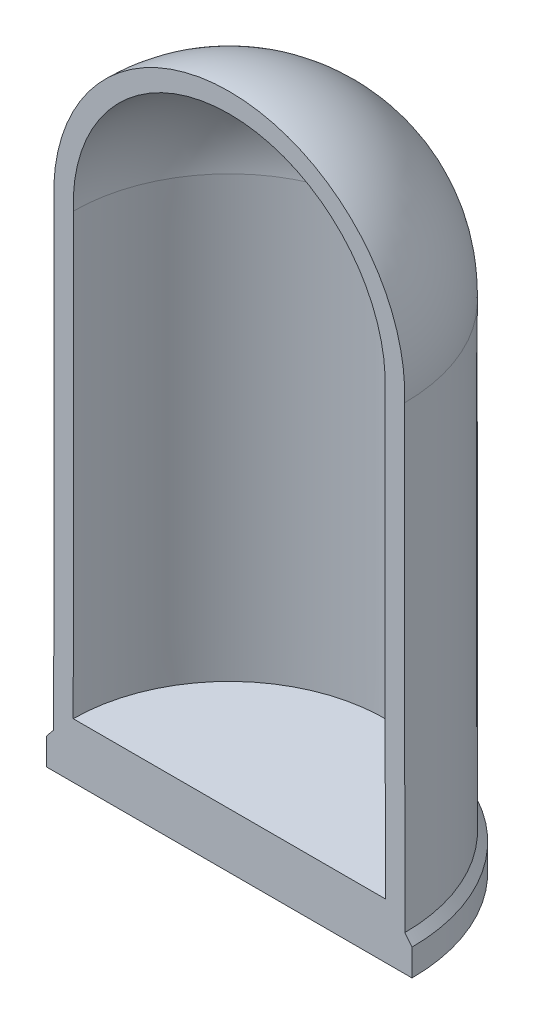
ISO-10303-21;
HEADER;
FILE_DESCRIPTION(('STEP AP214'),'2;1');
FILE_NAME('part.step','',(''),(''),'','','');
FILE_SCHEMA(('AUTOMOTIVE_DESIGN { 1 0 10303 214 1 1 1 1 }'));
ENDSEC;
DATA;
#1=APPLICATION_CONTEXT('core data for automotive mechanical design processes');
#2=APPLICATION_PROTOCOL_DEFINITION('international standard','automotive_design',2000,#1);
#3=PRODUCT_CONTEXT('',#1,'mechanical');
#4=PRODUCT('Part','Part','',(#3));
#5=PRODUCT_RELATED_PRODUCT_CATEGORY('part','',(#4));
#6=PRODUCT_DEFINITION_FORMATION('','',#4);
#7=PRODUCT_DEFINITION_CONTEXT('part definition',#1,'design');
#8=PRODUCT_DEFINITION('design','',#6,#7);
#9=PRODUCT_DEFINITION_SHAPE('','',#8);
#10=(LENGTH_UNIT() NAMED_UNIT(*) SI_UNIT(.MILLI.,.METRE.));
#11=(NAMED_UNIT(*) PLANE_ANGLE_UNIT() SI_UNIT($,.RADIAN.));
#12=(NAMED_UNIT(*) SI_UNIT($,.STERADIAN.) SOLID_ANGLE_UNIT());
#13=UNCERTAINTY_MEASURE_WITH_UNIT(LENGTH_MEASURE(1.E-05),#10,'distance_accuracy_value','');
#14=(GEOMETRIC_REPRESENTATION_CONTEXT(3) GLOBAL_UNCERTAINTY_ASSIGNED_CONTEXT((#13)) GLOBAL_UNIT_ASSIGNED_CONTEXT((#10,
#11,#12)) REPRESENTATION_CONTEXT('',''));
#15=CARTESIAN_POINT('',(0.,0.,0.));
#16=DIRECTION('',(0.,0.,1.));
#17=DIRECTION('',(1.,0.,0.));
#18=AXIS2_PLACEMENT_3D('',#15,#16,#17);
#19=CARTESIAN_POINT('',(0.,-61.875,0.));
#20=DIRECTION('',(0.,1.,0.));
#21=DIRECTION('',(-1.,0.,0.));
#22=AXIS2_PLACEMENT_3D('',#19,#20,#21);
#23=PLANE('',#22);
#24=CARTESIAN_POINT('',(0.,-61.875,0.));
#25=DIRECTION('',(0.,-1.,0.));
#26=DIRECTION('',(1.,0.,0.));
#27=AXIS2_PLACEMENT_3D('',#24,#25,#26);
#28=CIRCLE('',#27,205.);
#29=CARTESIAN_POINT('',(-205.,-61.875,1.43150734892569E-12));
#30=VERTEX_POINT('',#29);
#31=CARTESIAN_POINT('',(205.,-61.875,0.));
#32=VERTEX_POINT('',#31);
#33=EDGE_CURVE('E11',#30,#32,#28,.T.);
#34=ORIENTED_EDGE('',*,*,#33,.T.);
#35=DIRECTION('',(1.,0.,0.));
#36=VECTOR('',#35,1.);
#37=CARTESIAN_POINT('',(0.,-61.875,0.));
#38=LINE('',#37,#36);
#39=EDGE_CURVE('E88',#30,#32,#38,.T.);
#40=ORIENTED_EDGE('',*,*,#39,.F.);
#41=EDGE_LOOP('',(#34,#40));
#42=FACE_BOUND('',#41,.T.);
#43=ADVANCED_FACE('F34',(#42),#23,.F.);
#44=CARTESIAN_POINT('',(0.,914.773331767094,0.));
#45=DIRECTION('',(0.,-1.,0.));
#46=DIRECTION('',(1.,0.,0.));
#47=AXIS2_PLACEMENT_3D('',#44,#45,#46);
#48=CYLINDRICAL_SURFACE('',#47,205.);
#49=CARTESIAN_POINT('',(0.,-31.875,0.));
#50=DIRECTION('',(0.,-1.,0.));
#51=DIRECTION('',(1.,0.,0.));
#52=AXIS2_PLACEMENT_3D('',#49,#50,#51);
#53=CIRCLE('',#52,205.);
#54=CARTESIAN_POINT('',(-205.,-31.875,1.43150734892569E-12));
#55=VERTEX_POINT('',#54);
#56=CARTESIAN_POINT('',(205.,-31.875,0.));
#57=VERTEX_POINT('',#56);
#58=EDGE_CURVE('E41',#55,#57,#53,.T.);
#59=ORIENTED_EDGE('',*,*,#58,.T.);
#60=DIRECTION('',(0.,-1.,0.));
#61=VECTOR('',#60,1.);
#62=CARTESIAN_POINT('',(205.,0.,0.));
#63=LINE('',#62,#61);
#64=EDGE_CURVE('E92',#57,#32,#63,.T.);
#65=ORIENTED_EDGE('',*,*,#64,.T.);
#66=ORIENTED_EDGE('',*,*,#33,.F.);
#67=DIRECTION('',(0.,-1.,0.));
#68=VECTOR('',#67,1.);
#69=CARTESIAN_POINT('',(-205.,0.,1.43150734892569E-12));
#70=LINE('',#69,#68);
#71=EDGE_CURVE('E96',#55,#30,#70,.T.);
#72=ORIENTED_EDGE('',*,*,#71,.F.);
#73=EDGE_LOOP('',(#59,#65,#66,#72));
#74=FACE_BOUND('',#73,.T.);
#75=ADVANCED_FACE('F101',(#74),#48,.T.);
#76=CARTESIAN_POINT('',(0.,-21.875,0.));
#77=DIRECTION('',(0.,-1.,0.));
#78=DIRECTION('',(1.,0.,0.));
#79=AXIS2_PLACEMENT_3D('',#76,#77,#78);
#80=CONICAL_SURFACE('',#79,196.880944780873,0.68195836505234);
#81=CARTESIAN_POINT('',(0.,-21.875,0.));
#82=DIRECTION('',(0.,-1.,0.));
#83=DIRECTION('',(1.,0.,0.));
#84=AXIS2_PLACEMENT_3D('',#81,#82,#83);
#85=CIRCLE('',#84,196.880944780873);
#86=CARTESIAN_POINT('',(-196.880944780873,-21.875,1.37481228935245E-12));
#87=VERTEX_POINT('',#86);
#88=CARTESIAN_POINT('',(196.880944780873,-21.875,0.));
#89=VERTEX_POINT('',#88);
#90=EDGE_CURVE('E131',#87,#89,#85,.T.);
#91=ORIENTED_EDGE('',*,*,#90,.T.);
#92=DIRECTION('',(0.630314588512039,-0.776339822184138,0.));
#93=VECTOR('',#92,1.);
#94=CARTESIAN_POINT('',(107.956562690674,87.6505293752746,0.));
#95=LINE('',#94,#93);
#96=EDGE_CURVE('E102',#89,#57,#95,.T.);
#97=ORIENTED_EDGE('',*,*,#96,.T.);
#98=ORIENTED_EDGE('',*,*,#58,.F.);
#99=DIRECTION('',(-0.630314588512039,-0.776339822184138,0.));
#100=VECTOR('',#99,1.);
#101=CARTESIAN_POINT('',(-107.956562690674,87.6505293752746,7.53856648080273E-13));
#102=LINE('',#101,#100);
#103=EDGE_CURVE('E111',#87,#55,#102,.T.);
#104=ORIENTED_EDGE('',*,*,#103,.F.);
#105=EDGE_LOOP('',(#91,#97,#98,#104));
#106=FACE_BOUND('',#105,.T.);
#107=ADVANCED_FACE('F134',(#106),#80,.T.);
#108=CARTESIAN_POINT('',(0.,-21.875,0.));
#109=DIRECTION('',(0.,-1.,0.));
#110=DIRECTION('',(1.,0.,0.));
#111=AXIS2_PLACEMENT_3D('',#108,#109,#110);
#112=CONICAL_SURFACE('',#111,196.880944780873,0.000271724487689886);
#113=CARTESIAN_POINT('',(0.,492.740467835131,0.));
#114=DIRECTION('',(0.,-1.,0.));
#115=DIRECTION('',(1.,0.,0.));
#116=AXIS2_PLACEMENT_3D('',#113,#114,#115);
#117=CIRCLE('',#116,196.741111153077);
#118=CARTESIAN_POINT('',(-196.741111153077,492.740467835131,1.37383583634846E-12));
#119=VERTEX_POINT('',#118);
#120=CARTESIAN_POINT('',(196.741111153077,492.740467835131,0.));
#121=VERTEX_POINT('',#120);
#122=EDGE_CURVE('E128',#119,#121,#117,.T.);
#123=ORIENTED_EDGE('',*,*,#122,.T.);
#124=DIRECTION('',(-0.000271724484346169,0.999999963082902,0.));
#125=VECTOR('',#124,1.);
#126=CARTESIAN_POINT('',(196.874986271451,0.0534957561001773,0.));
#127=LINE('',#126,#125);
#128=EDGE_CURVE('E104',#89,#121,#127,.T.);
#129=ORIENTED_EDGE('',*,*,#128,.F.);
#130=ORIENTED_EDGE('',*,*,#90,.F.);
#131=DIRECTION('',(0.000271724484346253,0.999999963082902,0.));
#132=VECTOR('',#131,1.);
#133=CARTESIAN_POINT('',(-196.874986271451,0.0534957561001937,1.37477068130354E-12));
#134=LINE('',#133,#132);
#135=EDGE_CURVE('E113',#87,#119,#134,.T.);
#136=ORIENTED_EDGE('',*,*,#135,.T.);
#137=EDGE_LOOP('',(#123,#129,#130,#136));
#138=FACE_BOUND('',#137,.T.);
#139=ADVANCED_FACE('F139',(#138),#112,.T.);
#140=CARTESIAN_POINT('',(0.,500.,0.));
#141=DIRECTION('',(0.,-1.,0.));
#142=DIRECTION('',(-1.,0.,0.));
#143=AXIS2_PLACEMENT_3D('',#140,#141,#142);
#144=SPHERICAL_SURFACE('',#143,196.875);
#145=CARTESIAN_POINT('',(0.,500.,0.));
#146=DIRECTION('',(0.,0.,-1.));
#147=DIRECTION('',(-1.,0.,0.));
#148=AXIS2_PLACEMENT_3D('',#145,#146,#147);
#149=CIRCLE('',#148,196.875);
#150=EDGE_CURVE('E116',#119,#121,#149,.T.);
#151=ORIENTED_EDGE('',*,*,#150,.T.);
#152=ORIENTED_EDGE('',*,*,#122,.F.);
#153=EDGE_LOOP('',(#151,#152));
#154=FACE_BOUND('',#153,.T.);
#155=ADVANCED_FACE('F141',(#154),#144,.T.);
#156=CARTESIAN_POINT('',(0.,500.,0.));
#157=DIRECTION('',(0.,-1.,0.));
#158=DIRECTION('',(-1.,0.,0.));
#159=AXIS2_PLACEMENT_3D('',#156,#157,#158);
#160=SPHERICAL_SURFACE('',#159,175.);
#161=CARTESIAN_POINT('',(0.,493.152909574824,0.));
#162=DIRECTION('',(0.,-1.,0.));
#163=DIRECTION('',(1.,0.,0.));
#164=AXIS2_PLACEMENT_3D('',#161,#162,#163);
#165=CIRCLE('',#164,174.865998274992);
#166=CARTESIAN_POINT('',(-174.865998274992,493.152909574824,1.22108273955062E-12));
#167=VERTEX_POINT('',#166);
#168=CARTESIAN_POINT('',(174.865998274992,493.152909574824,0.));
#169=VERTEX_POINT('',#168);
#170=EDGE_CURVE('E54',#167,#169,#165,.T.);
#171=ORIENTED_EDGE('',*,*,#170,.T.);
#172=CARTESIAN_POINT('',(0.,500.,0.));
#173=DIRECTION('',(0.,0.,-1.));
#174=DIRECTION('',(-1.,0.,0.));
#175=AXIS2_PLACEMENT_3D('',#172,#173,#174);
#176=CIRCLE('',#175,175.);
#177=EDGE_CURVE('E118',#167,#169,#176,.T.);
#178=ORIENTED_EDGE('',*,*,#177,.F.);
#179=EDGE_LOOP('',(#171,#178));
#180=FACE_BOUND('',#179,.T.);
#181=ADVANCED_FACE('F143',(#180),#160,.F.);
#182=CARTESIAN_POINT('',(0.,0.,0.));
#183=DIRECTION('',(0.,-1.,0.));
#184=DIRECTION('',(1.,0.,0.));
#185=AXIS2_PLACEMENT_3D('',#182,#183,#184);
#186=CONICAL_SURFACE('',#185,174.999999999997,0.000271724487689777);
#187=CARTESIAN_POINT('',(0.,0.,0.));
#188=DIRECTION('',(0.,-1.,0.));
#189=DIRECTION('',(1.,0.,0.));
#190=AXIS2_PLACEMENT_3D('',#187,#188,#189);
#191=CIRCLE('',#190,174.999999999997);
#192=CARTESIAN_POINT('',(-174.999999999997,0.,1.22201846859507E-12));
#193=VERTEX_POINT('',#192);
#194=CARTESIAN_POINT('',(174.999999999997,0.,0.));
#195=VERTEX_POINT('',#194);
#196=EDGE_CURVE('E47',#193,#195,#191,.T.);
#197=ORIENTED_EDGE('',*,*,#196,.T.);
#198=DIRECTION('',(-0.000271724484346128,0.999999963082902,0.));
#199=VECTOR('',#198,1.);
#200=CARTESIAN_POINT('',(174.999987079013,0.0475517830050977,0.));
#201=LINE('',#200,#199);
#202=EDGE_CURVE('E98',#195,#169,#201,.T.);
#203=ORIENTED_EDGE('',*,*,#202,.T.);
#204=ORIENTED_EDGE('',*,*,#170,.F.);
#205=DIRECTION('',(0.000271724484346212,0.999999963082902,0.));
#206=VECTOR('',#205,1.);
#207=CARTESIAN_POINT('',(-174.999987079013,0.0475517830051122,1.22201837836832E-12));
#208=LINE('',#207,#206);
#209=EDGE_CURVE('E120',#193,#167,#208,.T.);
#210=ORIENTED_EDGE('',*,*,#209,.F.);
#211=EDGE_LOOP('',(#197,#203,#204,#210));
#212=FACE_BOUND('',#211,.T.);
#213=ADVANCED_FACE('F149',(#212),#186,.F.);
#214=CARTESIAN_POINT('',(0.,0.,0.));
#215=DIRECTION('',(0.,-1.,0.));
#216=DIRECTION('',(1.,0.,0.));
#217=AXIS2_PLACEMENT_3D('',#214,#215,#216);
#218=PLANE('',#217);
#219=DIRECTION('',(-1.,0.,0.));
#220=VECTOR('',#219,1.);
#221=CARTESIAN_POINT('',(0.,0.,0.));
#222=LINE('',#221,#220);
#223=EDGE_CURVE('E123',#195,#193,#222,.T.);
#224=ORIENTED_EDGE('',*,*,#223,.F.);
#225=ORIENTED_EDGE('',*,*,#196,.F.);
#226=EDGE_LOOP('',(#224,#225));
#227=FACE_BOUND('',#226,.T.);
#228=ADVANCED_FACE('F186',(#227),#218,.F.);
#229=CARTESIAN_POINT('',(0.,0.,0.));
#230=DIRECTION('',(0.,0.,-1.));
#231=DIRECTION('',(-1.,0.,0.));
#232=AXIS2_PLACEMENT_3D('',#229,#230,#231);
#233=PLANE('',#232);
#234=ORIENTED_EDGE('',*,*,#202,.F.);
#235=ORIENTED_EDGE('',*,*,#223,.T.);
#236=ORIENTED_EDGE('',*,*,#209,.T.);
#237=ORIENTED_EDGE('',*,*,#177,.T.);
#238=EDGE_LOOP('',(#234,#235,#236,#237));
#239=FACE_BOUND('',#238,.T.);
#240=ORIENTED_EDGE('',*,*,#39,.T.);
#241=ORIENTED_EDGE('',*,*,#64,.F.);
#242=ORIENTED_EDGE('',*,*,#96,.F.);
#243=ORIENTED_EDGE('',*,*,#128,.T.);
#244=ORIENTED_EDGE('',*,*,#150,.F.);
#245=ORIENTED_EDGE('',*,*,#135,.F.);
#246=ORIENTED_EDGE('',*,*,#103,.T.);
#247=ORIENTED_EDGE('',*,*,#71,.T.);
#248=EDGE_LOOP('',(#240,#241,#242,#243,#244,#245,#246,#247));
#249=FACE_BOUND('',#248,.T.);
#250=ADVANCED_FACE('F89',(#239,#249),#233,.F.);
#251=CLOSED_SHELL('',(#43,#75,#107,#139,#155,#181,#213,#228,#250));
#252=MANIFOLD_SOLID_BREP('B2',#251);
#253=ADVANCED_BREP_SHAPE_REPRESENTATION('',(#18,#252),#14);
#254=SHAPE_DEFINITION_REPRESENTATION(#9,#253);
ENDSEC;
END-ISO-10303-21;
